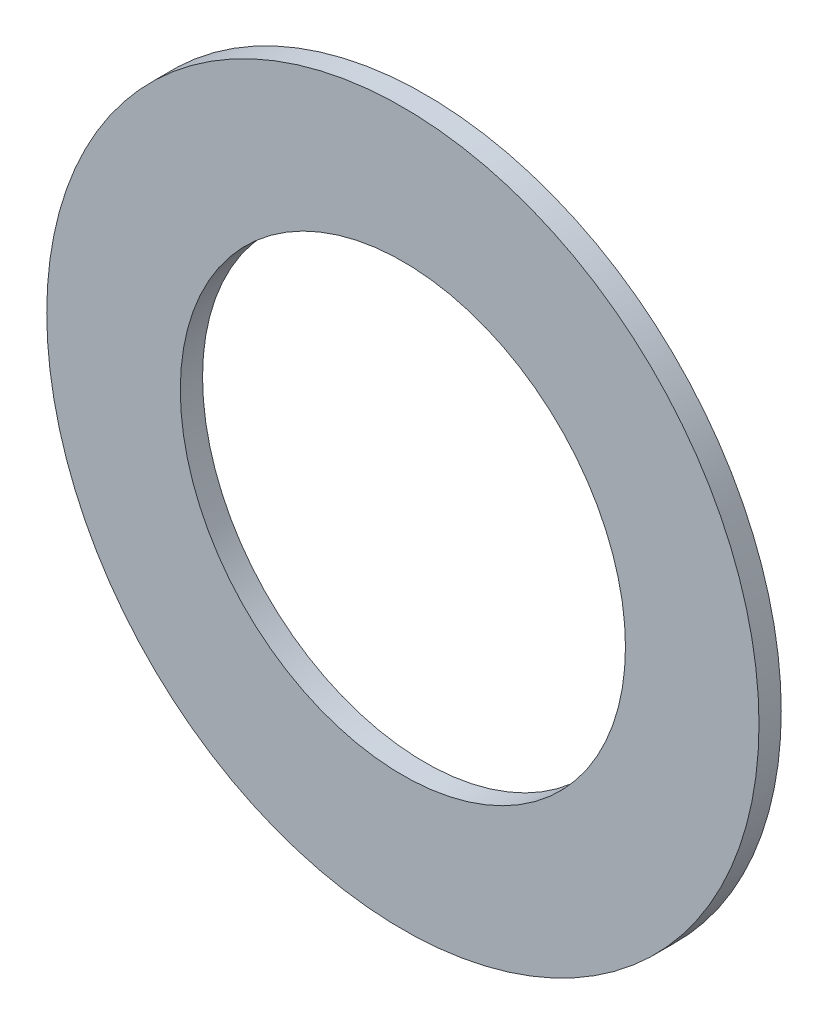
ISO-10303-21;
HEADER;
FILE_DESCRIPTION(('STEP AP214'),'2;1');
FILE_NAME('part.step','',(''),(''),'','','');
FILE_SCHEMA(('AUTOMOTIVE_DESIGN { 1 0 10303 214 1 1 1 1 }'));
ENDSEC;
DATA;
#1=APPLICATION_CONTEXT('core data for automotive mechanical design processes');
#2=APPLICATION_PROTOCOL_DEFINITION('international standard','automotive_design',2000,#1);
#3=PRODUCT_CONTEXT('',#1,'mechanical');
#4=PRODUCT('Part','Part','',(#3));
#5=PRODUCT_RELATED_PRODUCT_CATEGORY('part','',(#4));
#6=PRODUCT_DEFINITION_FORMATION('','',#4);
#7=PRODUCT_DEFINITION_CONTEXT('part definition',#1,'design');
#8=PRODUCT_DEFINITION('design','',#6,#7);
#9=PRODUCT_DEFINITION_SHAPE('','',#8);
#10=(LENGTH_UNIT() NAMED_UNIT(*) SI_UNIT(.MILLI.,.METRE.));
#11=(NAMED_UNIT(*) PLANE_ANGLE_UNIT() SI_UNIT($,.RADIAN.));
#12=(NAMED_UNIT(*) SI_UNIT($,.STERADIAN.) SOLID_ANGLE_UNIT());
#13=UNCERTAINTY_MEASURE_WITH_UNIT(LENGTH_MEASURE(1.E-05),#10,'distance_accuracy_value','');
#14=(GEOMETRIC_REPRESENTATION_CONTEXT(3) GLOBAL_UNCERTAINTY_ASSIGNED_CONTEXT((#13)) GLOBAL_UNIT_ASSIGNED_CONTEXT((#10,
#11,#12)) REPRESENTATION_CONTEXT('',''));
#15=CARTESIAN_POINT('',(0.,0.,0.));
#16=DIRECTION('',(0.,0.,1.));
#17=DIRECTION('',(1.,0.,0.));
#18=AXIS2_PLACEMENT_3D('',#15,#16,#17);
#19=CARTESIAN_POINT('',(0.,0.,0.5));
#20=DIRECTION('',(0.,0.,1.));
#21=DIRECTION('',(1.,0.,0.));
#22=AXIS2_PLACEMENT_3D('',#19,#20,#21);
#23=PLANE('',#22);
#24=CARTESIAN_POINT('',(0.,0.,0.5));
#25=DIRECTION('',(0.,0.,1.));
#26=DIRECTION('',(1.,0.,0.));
#27=AXIS2_PLACEMENT_3D('',#24,#25,#26);
#28=CIRCLE('',#27,8.);
#29=CARTESIAN_POINT('',(8.,0.,0.5));
#30=VERTEX_POINT('',#29);
#31=EDGE_CURVE('E10',#30,#30,#28,.T.);
#32=ORIENTED_EDGE('',*,*,#31,.T.);
#33=EDGE_LOOP('',(#32));
#34=FACE_BOUND('',#33,.T.);
#35=CARTESIAN_POINT('',(0.,0.,0.5));
#36=DIRECTION('',(0.,0.,1.));
#37=DIRECTION('',(1.,0.,0.));
#38=AXIS2_PLACEMENT_3D('',#35,#36,#37);
#39=CIRCLE('',#38,5.);
#40=CARTESIAN_POINT('',(5.,0.,0.5));
#41=VERTEX_POINT('',#40);
#42=EDGE_CURVE('E41',#41,#41,#39,.T.);
#43=ORIENTED_EDGE('',*,*,#42,.F.);
#44=EDGE_LOOP('',(#43));
#45=FACE_BOUND('',#44,.T.);
#46=ADVANCED_FACE('F30',(#34,#45),#23,.T.);
#47=CARTESIAN_POINT('',(0.,0.,0.));
#48=DIRECTION('',(0.,0.,1.));
#49=DIRECTION('',(1.,0.,0.));
#50=AXIS2_PLACEMENT_3D('',#47,#48,#49);
#51=PLANE('',#50);
#52=CARTESIAN_POINT('',(0.,0.,0.));
#53=DIRECTION('',(0.,0.,1.));
#54=DIRECTION('',(1.,0.,0.));
#55=AXIS2_PLACEMENT_3D('',#52,#53,#54);
#56=CIRCLE('',#55,8.);
#57=CARTESIAN_POINT('',(8.,0.,0.));
#58=VERTEX_POINT('',#57);
#59=EDGE_CURVE('E34',#58,#58,#56,.T.);
#60=ORIENTED_EDGE('',*,*,#59,.F.);
#61=EDGE_LOOP('',(#60));
#62=FACE_BOUND('',#61,.T.);
#63=CARTESIAN_POINT('',(0.,0.,0.));
#64=DIRECTION('',(0.,0.,1.));
#65=DIRECTION('',(1.,0.,0.));
#66=AXIS2_PLACEMENT_3D('',#63,#64,#65);
#67=CIRCLE('',#66,5.);
#68=CARTESIAN_POINT('',(5.,0.,0.));
#69=VERTEX_POINT('',#68);
#70=EDGE_CURVE('E43',#69,#69,#67,.T.);
#71=ORIENTED_EDGE('',*,*,#70,.T.);
#72=EDGE_LOOP('',(#71));
#73=FACE_BOUND('',#72,.T.);
#74=ADVANCED_FACE('F53',(#62,#73),#51,.F.);
#75=CARTESIAN_POINT('',(0.,0.,0.5));
#76=DIRECTION('',(0.,0.,-1.));
#77=DIRECTION('',(-1.,0.,0.));
#78=AXIS2_PLACEMENT_3D('',#75,#76,#77);
#79=CYLINDRICAL_SURFACE('',#78,8.);
#80=ORIENTED_EDGE('',*,*,#31,.F.);
#81=EDGE_LOOP('',(#80));
#82=FACE_BOUND('',#81,.T.);
#83=ORIENTED_EDGE('',*,*,#59,.T.);
#84=EDGE_LOOP('',(#83));
#85=FACE_BOUND('',#84,.T.);
#86=ADVANCED_FACE('F32',(#82,#85),#79,.T.);
#87=CARTESIAN_POINT('',(0.,0.,0.5));
#88=DIRECTION('',(0.,0.,-1.));
#89=DIRECTION('',(-1.,0.,0.));
#90=AXIS2_PLACEMENT_3D('',#87,#88,#89);
#91=CYLINDRICAL_SURFACE('',#90,5.);
#92=ORIENTED_EDGE('',*,*,#42,.T.);
#93=EDGE_LOOP('',(#92));
#94=FACE_BOUND('',#93,.T.);
#95=ORIENTED_EDGE('',*,*,#70,.F.);
#96=EDGE_LOOP('',(#95));
#97=FACE_BOUND('',#96,.T.);
#98=ADVANCED_FACE('F49',(#94,#97),#91,.F.);
#99=CLOSED_SHELL('',(#46,#74,#86,#98));
#100=MANIFOLD_SOLID_BREP('B2',#99);
#101=ADVANCED_BREP_SHAPE_REPRESENTATION('',(#18,#100),#14);
#102=SHAPE_DEFINITION_REPRESENTATION(#9,#101);
ENDSEC;
END-ISO-10303-21;
